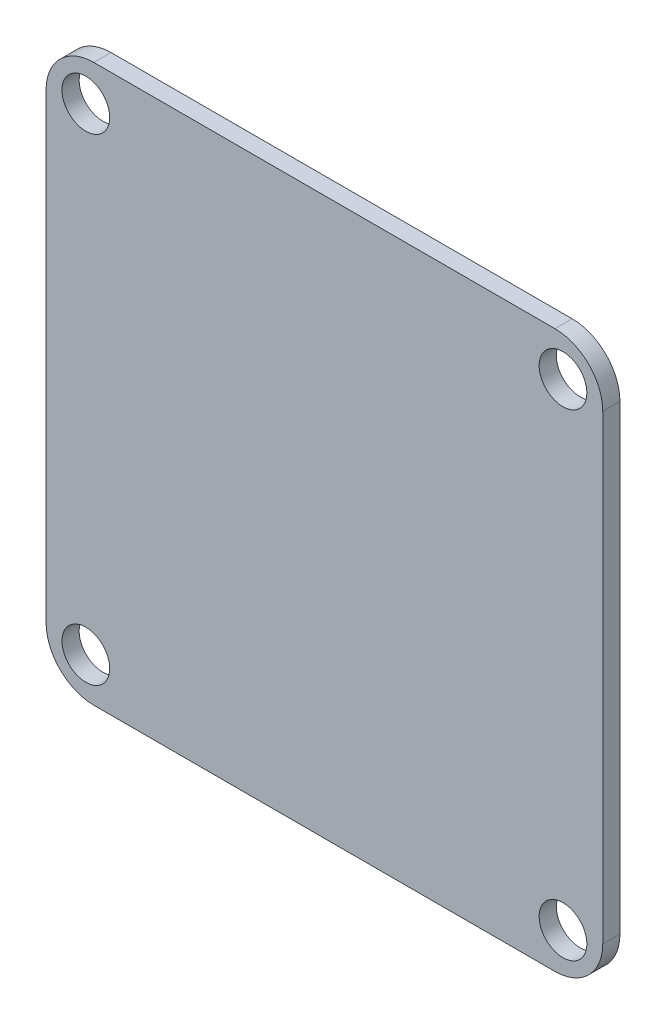
ISO-10303-21;
HEADER;
FILE_DESCRIPTION(('STEP AP214'),'2;1');
FILE_NAME('part.step','',(''),(''),'','','');
FILE_SCHEMA(('AUTOMOTIVE_DESIGN { 1 0 10303 214 1 1 1 1 }'));
ENDSEC;
DATA;
#1=APPLICATION_CONTEXT('core data for automotive mechanical design processes');
#2=APPLICATION_PROTOCOL_DEFINITION('international standard','automotive_design',2000,#1);
#3=PRODUCT_CONTEXT('',#1,'mechanical');
#4=PRODUCT('Part','Part','',(#3));
#5=PRODUCT_RELATED_PRODUCT_CATEGORY('part','',(#4));
#6=PRODUCT_DEFINITION_FORMATION('','',#4);
#7=PRODUCT_DEFINITION_CONTEXT('part definition',#1,'design');
#8=PRODUCT_DEFINITION('design','',#6,#7);
#9=PRODUCT_DEFINITION_SHAPE('','',#8);
#10=(LENGTH_UNIT() NAMED_UNIT(*) SI_UNIT(.MILLI.,.METRE.));
#11=(NAMED_UNIT(*) PLANE_ANGLE_UNIT() SI_UNIT($,.RADIAN.));
#12=(NAMED_UNIT(*) SI_UNIT($,.STERADIAN.) SOLID_ANGLE_UNIT());
#13=UNCERTAINTY_MEASURE_WITH_UNIT(LENGTH_MEASURE(1.E-05),#10,'distance_accuracy_value','');
#14=(GEOMETRIC_REPRESENTATION_CONTEXT(3) GLOBAL_UNCERTAINTY_ASSIGNED_CONTEXT((#13)) GLOBAL_UNIT_ASSIGNED_CONTEXT((#10,
#11,#12)) REPRESENTATION_CONTEXT('',''));
#15=CARTESIAN_POINT('',(0.,0.,0.));
#16=DIRECTION('',(0.,0.,1.));
#17=DIRECTION('',(1.,0.,0.));
#18=AXIS2_PLACEMENT_3D('',#15,#16,#17);
#19=CARTESIAN_POINT('',(14.5,-14.5,1.08));
#20=DIRECTION('',(0.,0.,1.));
#21=DIRECTION('',(1.,0.,0.));
#22=AXIS2_PLACEMENT_3D('',#19,#20,#21);
#23=PLANE('',#22);
#24=CARTESIAN_POINT('',(15.,15.,1.08));
#25=DIRECTION('',(0.,0.,1.));
#26=DIRECTION('',(1.,0.,0.));
#27=AXIS2_PLACEMENT_3D('',#24,#25,#26);
#28=CIRCLE('',#27,1.5);
#29=CARTESIAN_POINT('',(16.5,15.,1.08));
#30=VERTEX_POINT('',#29);
#31=EDGE_CURVE('E248',#30,#30,#28,.T.);
#32=ORIENTED_EDGE('',*,*,#31,.F.);
#33=EDGE_LOOP('',(#32));
#34=FACE_BOUND('',#33,.T.);
#35=CARTESIAN_POINT('',(-15.,-15.,1.08));
#36=DIRECTION('',(0.,0.,1.));
#37=DIRECTION('',(1.,0.,0.));
#38=AXIS2_PLACEMENT_3D('',#35,#36,#37);
#39=CIRCLE('',#38,1.5);
#40=CARTESIAN_POINT('',(-13.5,-15.,1.08));
#41=VERTEX_POINT('',#40);
#42=EDGE_CURVE('E171',#41,#41,#39,.T.);
#43=ORIENTED_EDGE('',*,*,#42,.F.);
#44=EDGE_LOOP('',(#43));
#45=FACE_BOUND('',#44,.T.);
#46=CARTESIAN_POINT('',(14.5,-14.5,1.08));
#47=DIRECTION('',(0.,0.,1.));
#48=DIRECTION('',(1.,0.,0.));
#49=AXIS2_PLACEMENT_3D('',#46,#47,#48);
#50=CIRCLE('',#49,3.);
#51=CARTESIAN_POINT('',(14.5,-17.5,1.08));
#52=VERTEX_POINT('',#51);
#53=CARTESIAN_POINT('',(17.5,-14.5,1.08));
#54=VERTEX_POINT('',#53);
#55=EDGE_CURVE('E192',#52,#54,#50,.T.);
#56=ORIENTED_EDGE('',*,*,#55,.T.);
#57=DIRECTION('',(0.,1.,0.));
#58=VECTOR('',#57,1.);
#59=CARTESIAN_POINT('',(17.5,-14.5,1.08));
#60=LINE('',#59,#58);
#61=CARTESIAN_POINT('',(17.5,14.5,1.08));
#62=VERTEX_POINT('',#61);
#63=EDGE_CURVE('E123',#54,#62,#60,.T.);
#64=ORIENTED_EDGE('',*,*,#63,.T.);
#65=CARTESIAN_POINT('',(14.5,14.5,1.08));
#66=DIRECTION('',(0.,0.,1.));
#67=DIRECTION('',(-1.,0.,0.));
#68=AXIS2_PLACEMENT_3D('',#65,#66,#67);
#69=CIRCLE('',#68,3.);
#70=CARTESIAN_POINT('',(14.5,17.5,1.08));
#71=VERTEX_POINT('',#70);
#72=EDGE_CURVE('E211',#62,#71,#69,.T.);
#73=ORIENTED_EDGE('',*,*,#72,.T.);
#74=DIRECTION('',(-1.,0.,0.));
#75=VECTOR('',#74,1.);
#76=CARTESIAN_POINT('',(-14.5,17.5,1.08));
#77=LINE('',#76,#75);
#78=CARTESIAN_POINT('',(-14.5,17.5,1.08));
#79=VERTEX_POINT('',#78);
#80=EDGE_CURVE('E230',#71,#79,#77,.T.);
#81=ORIENTED_EDGE('',*,*,#80,.T.);
#82=CARTESIAN_POINT('',(-14.5,14.5,1.08));
#83=DIRECTION('',(0.,0.,1.));
#84=DIRECTION('',(-1.,0.,0.));
#85=AXIS2_PLACEMENT_3D('',#82,#83,#84);
#86=CIRCLE('',#85,3.);
#87=CARTESIAN_POINT('',(-17.5,14.5,1.08));
#88=VERTEX_POINT('',#87);
#89=EDGE_CURVE('E144',#79,#88,#86,.T.);
#90=ORIENTED_EDGE('',*,*,#89,.T.);
#91=DIRECTION('',(0.,-1.,0.));
#92=VECTOR('',#91,1.);
#93=CARTESIAN_POINT('',(-17.5,-14.5,1.08));
#94=LINE('',#93,#92);
#95=CARTESIAN_POINT('',(-17.5,-14.5,1.08));
#96=VERTEX_POINT('',#95);
#97=EDGE_CURVE('E137',#88,#96,#94,.T.);
#98=ORIENTED_EDGE('',*,*,#97,.T.);
#99=CARTESIAN_POINT('',(-14.5,-14.5,1.08));
#100=DIRECTION('',(0.,0.,1.));
#101=DIRECTION('',(-1.,0.,0.));
#102=AXIS2_PLACEMENT_3D('',#99,#100,#101);
#103=CIRCLE('',#102,3.);
#104=CARTESIAN_POINT('',(-14.5,-17.5,1.08));
#105=VERTEX_POINT('',#104);
#106=EDGE_CURVE('E142',#96,#105,#103,.T.);
#107=ORIENTED_EDGE('',*,*,#106,.T.);
#108=DIRECTION('',(1.,0.,0.));
#109=VECTOR('',#108,1.);
#110=CARTESIAN_POINT('',(-14.5,-17.5,1.08));
#111=LINE('',#110,#109);
#112=EDGE_CURVE('E64',#105,#52,#111,.T.);
#113=ORIENTED_EDGE('',*,*,#112,.T.);
#114=EDGE_LOOP('',(#56,#64,#73,#81,#90,#98,#107,#113));
#115=FACE_BOUND('',#114,.T.);
#116=CARTESIAN_POINT('',(15.,-15.,1.08));
#117=DIRECTION('',(0.,0.,1.));
#118=DIRECTION('',(-1.,0.,0.));
#119=AXIS2_PLACEMENT_3D('',#116,#117,#118);
#120=CIRCLE('',#119,1.5);
#121=CARTESIAN_POINT('',(13.5,-15.,1.08));
#122=VERTEX_POINT('',#121);
#123=EDGE_CURVE('E245',#122,#122,#120,.T.);
#124=ORIENTED_EDGE('',*,*,#123,.F.);
#125=EDGE_LOOP('',(#124));
#126=FACE_BOUND('',#125,.T.);
#127=CARTESIAN_POINT('',(-15.,15.,1.08));
#128=DIRECTION('',(0.,0.,1.));
#129=DIRECTION('',(-1.,0.,0.));
#130=AXIS2_PLACEMENT_3D('',#127,#128,#129);
#131=CIRCLE('',#130,1.5);
#132=CARTESIAN_POINT('',(-16.5,15.,1.08));
#133=VERTEX_POINT('',#132);
#134=EDGE_CURVE('E256',#133,#133,#131,.T.);
#135=ORIENTED_EDGE('',*,*,#134,.F.);
#136=EDGE_LOOP('',(#135));
#137=FACE_BOUND('',#136,.T.);
#138=ADVANCED_FACE('F43',(#34,#45,#115,#126,#137),#23,.T.);
#139=CARTESIAN_POINT('',(14.5,-14.5,0.));
#140=DIRECTION('',(0.,0.,1.));
#141=DIRECTION('',(1.,0.,0.));
#142=AXIS2_PLACEMENT_3D('',#139,#140,#141);
#143=PLANE('',#142);
#144=CARTESIAN_POINT('',(14.5,-14.5,0.));
#145=DIRECTION('',(0.,0.,1.));
#146=DIRECTION('',(1.,0.,0.));
#147=AXIS2_PLACEMENT_3D('',#144,#145,#146);
#148=CIRCLE('',#147,3.);
#149=CARTESIAN_POINT('',(14.5,-17.5,0.));
#150=VERTEX_POINT('',#149);
#151=CARTESIAN_POINT('',(17.5,-14.5,0.));
#152=VERTEX_POINT('',#151);
#153=EDGE_CURVE('E166',#150,#152,#148,.T.);
#154=ORIENTED_EDGE('',*,*,#153,.F.);
#155=DIRECTION('',(1.,0.,0.));
#156=VECTOR('',#155,1.);
#157=CARTESIAN_POINT('',(-14.5,-17.5,0.));
#158=LINE('',#157,#156);
#159=CARTESIAN_POINT('',(-14.5,-17.5,0.));
#160=VERTEX_POINT('',#159);
#161=EDGE_CURVE('E112',#160,#150,#158,.T.);
#162=ORIENTED_EDGE('',*,*,#161,.F.);
#163=CARTESIAN_POINT('',(-14.5,-14.5,0.));
#164=DIRECTION('',(0.,0.,1.));
#165=DIRECTION('',(-1.,0.,0.));
#166=AXIS2_PLACEMENT_3D('',#163,#164,#165);
#167=CIRCLE('',#166,3.);
#168=CARTESIAN_POINT('',(-17.5,-14.5,0.));
#169=VERTEX_POINT('',#168);
#170=EDGE_CURVE('E104',#169,#160,#167,.T.);
#171=ORIENTED_EDGE('',*,*,#170,.F.);
#172=DIRECTION('',(0.,-1.,0.));
#173=VECTOR('',#172,1.);
#174=CARTESIAN_POINT('',(-17.5,-14.5,0.));
#175=LINE('',#174,#173);
#176=CARTESIAN_POINT('',(-17.5,14.5,0.));
#177=VERTEX_POINT('',#176);
#178=EDGE_CURVE('E152',#177,#169,#175,.T.);
#179=ORIENTED_EDGE('',*,*,#178,.F.);
#180=CARTESIAN_POINT('',(-14.5,14.5,0.));
#181=DIRECTION('',(0.,0.,1.));
#182=DIRECTION('',(-1.,0.,0.));
#183=AXIS2_PLACEMENT_3D('',#180,#181,#182);
#184=CIRCLE('',#183,3.);
#185=CARTESIAN_POINT('',(-14.5,17.5,0.));
#186=VERTEX_POINT('',#185);
#187=EDGE_CURVE('E185',#186,#177,#184,.T.);
#188=ORIENTED_EDGE('',*,*,#187,.F.);
#189=DIRECTION('',(-1.,0.,0.));
#190=VECTOR('',#189,1.);
#191=CARTESIAN_POINT('',(-14.5,17.5,0.));
#192=LINE('',#191,#190);
#193=CARTESIAN_POINT('',(14.5,17.5,0.));
#194=VERTEX_POINT('',#193);
#195=EDGE_CURVE('E177',#194,#186,#192,.T.);
#196=ORIENTED_EDGE('',*,*,#195,.F.);
#197=CARTESIAN_POINT('',(14.5,14.5,0.));
#198=DIRECTION('',(0.,0.,1.));
#199=DIRECTION('',(-1.,0.,0.));
#200=AXIS2_PLACEMENT_3D('',#197,#198,#199);
#201=CIRCLE('',#200,3.);
#202=CARTESIAN_POINT('',(17.5,14.5,0.));
#203=VERTEX_POINT('',#202);
#204=EDGE_CURVE('E176',#203,#194,#201,.T.);
#205=ORIENTED_EDGE('',*,*,#204,.F.);
#206=DIRECTION('',(0.,1.,0.));
#207=VECTOR('',#206,1.);
#208=CARTESIAN_POINT('',(17.5,-14.5,0.));
#209=LINE('',#208,#207);
#210=EDGE_CURVE('E175',#152,#203,#209,.T.);
#211=ORIENTED_EDGE('',*,*,#210,.F.);
#212=EDGE_LOOP('',(#154,#162,#171,#179,#188,#196,#205,#211));
#213=FACE_BOUND('',#212,.T.);
#214=CARTESIAN_POINT('',(-15.,-15.,0.));
#215=DIRECTION('',(0.,0.,1.));
#216=DIRECTION('',(1.,0.,0.));
#217=AXIS2_PLACEMENT_3D('',#214,#215,#216);
#218=CIRCLE('',#217,1.5);
#219=CARTESIAN_POINT('',(-13.5,-15.,0.));
#220=VERTEX_POINT('',#219);
#221=EDGE_CURVE('E239',#220,#220,#218,.T.);
#222=ORIENTED_EDGE('',*,*,#221,.T.);
#223=EDGE_LOOP('',(#222));
#224=FACE_BOUND('',#223,.T.);
#225=CARTESIAN_POINT('',(15.,-15.,0.));
#226=DIRECTION('',(0.,0.,1.));
#227=DIRECTION('',(-1.,0.,0.));
#228=AXIS2_PLACEMENT_3D('',#225,#226,#227);
#229=CIRCLE('',#228,1.5);
#230=CARTESIAN_POINT('',(13.5,-15.,0.));
#231=VERTEX_POINT('',#230);
#232=EDGE_CURVE('E247',#231,#231,#229,.T.);
#233=ORIENTED_EDGE('',*,*,#232,.T.);
#234=EDGE_LOOP('',(#233));
#235=FACE_BOUND('',#234,.T.);
#236=CARTESIAN_POINT('',(15.,15.,0.));
#237=DIRECTION('',(0.,0.,1.));
#238=DIRECTION('',(1.,0.,0.));
#239=AXIS2_PLACEMENT_3D('',#236,#237,#238);
#240=CIRCLE('',#239,1.5);
#241=CARTESIAN_POINT('',(16.5,15.,0.));
#242=VERTEX_POINT('',#241);
#243=EDGE_CURVE('E252',#242,#242,#240,.T.);
#244=ORIENTED_EDGE('',*,*,#243,.T.);
#245=EDGE_LOOP('',(#244));
#246=FACE_BOUND('',#245,.T.);
#247=CARTESIAN_POINT('',(-15.,15.,0.));
#248=DIRECTION('',(0.,0.,1.));
#249=DIRECTION('',(-1.,0.,0.));
#250=AXIS2_PLACEMENT_3D('',#247,#248,#249);
#251=CIRCLE('',#250,1.5);
#252=CARTESIAN_POINT('',(-16.5,15.,0.));
#253=VERTEX_POINT('',#252);
#254=EDGE_CURVE('E265',#253,#253,#251,.T.);
#255=ORIENTED_EDGE('',*,*,#254,.T.);
#256=EDGE_LOOP('',(#255));
#257=FACE_BOUND('',#256,.T.);
#258=ADVANCED_FACE('F220',(#213,#224,#235,#246,#257),#143,.F.);
#259=CARTESIAN_POINT('',(14.5,-14.5,1.08));
#260=DIRECTION('',(0.,0.,-1.));
#261=DIRECTION('',(-1.,0.,0.));
#262=AXIS2_PLACEMENT_3D('',#259,#260,#261);
#263=CYLINDRICAL_SURFACE('',#262,3.);
#264=ORIENTED_EDGE('',*,*,#153,.T.);
#265=DIRECTION('',(0.,0.,-1.));
#266=VECTOR('',#265,1.);
#267=CARTESIAN_POINT('',(17.5,-14.5,1.08));
#268=LINE('',#267,#266);
#269=EDGE_CURVE('E11',#54,#152,#268,.T.);
#270=ORIENTED_EDGE('',*,*,#269,.F.);
#271=ORIENTED_EDGE('',*,*,#55,.F.);
#272=DIRECTION('',(0.,0.,-1.));
#273=VECTOR('',#272,1.);
#274=CARTESIAN_POINT('',(14.5,-17.5,1.08));
#275=LINE('',#274,#273);
#276=EDGE_CURVE('E162',#52,#150,#275,.T.);
#277=ORIENTED_EDGE('',*,*,#276,.T.);
#278=EDGE_LOOP('',(#264,#270,#271,#277));
#279=FACE_BOUND('',#278,.T.);
#280=ADVANCED_FACE('F44',(#279),#263,.T.);
#281=CARTESIAN_POINT('',(17.5,-14.5,1.08));
#282=DIRECTION('',(-1.,0.,0.));
#283=DIRECTION('',(0.,0.,1.));
#284=AXIS2_PLACEMENT_3D('',#281,#282,#283);
#285=PLANE('',#284);
#286=ORIENTED_EDGE('',*,*,#210,.T.);
#287=DIRECTION('',(0.,0.,-1.));
#288=VECTOR('',#287,1.);
#289=CARTESIAN_POINT('',(17.5,14.5,1.08));
#290=LINE('',#289,#288);
#291=EDGE_CURVE('E52',#62,#203,#290,.T.);
#292=ORIENTED_EDGE('',*,*,#291,.F.);
#293=ORIENTED_EDGE('',*,*,#63,.F.);
#294=ORIENTED_EDGE('',*,*,#269,.T.);
#295=EDGE_LOOP('',(#286,#292,#293,#294));
#296=FACE_BOUND('',#295,.T.);
#297=ADVANCED_FACE('F297',(#296),#285,.F.);
#298=CARTESIAN_POINT('',(14.5,14.5,1.08));
#299=DIRECTION('',(0.,0.,-1.));
#300=DIRECTION('',(-1.,0.,0.));
#301=AXIS2_PLACEMENT_3D('',#298,#299,#300);
#302=CYLINDRICAL_SURFACE('',#301,3.);
#303=ORIENTED_EDGE('',*,*,#204,.T.);
#304=DIRECTION('',(0.,0.,-1.));
#305=VECTOR('',#304,1.);
#306=CARTESIAN_POINT('',(14.5,17.5,1.08));
#307=LINE('',#306,#305);
#308=EDGE_CURVE('E205',#71,#194,#307,.T.);
#309=ORIENTED_EDGE('',*,*,#308,.F.);
#310=ORIENTED_EDGE('',*,*,#72,.F.);
#311=ORIENTED_EDGE('',*,*,#291,.T.);
#312=EDGE_LOOP('',(#303,#309,#310,#311));
#313=FACE_BOUND('',#312,.T.);
#314=ADVANCED_FACE('F213',(#313),#302,.T.);
#315=CARTESIAN_POINT('',(-14.5,17.5,1.08));
#316=DIRECTION('',(0.,-1.,0.));
#317=DIRECTION('',(0.,0.,-1.));
#318=AXIS2_PLACEMENT_3D('',#315,#316,#317);
#319=PLANE('',#318);
#320=ORIENTED_EDGE('',*,*,#195,.T.);
#321=DIRECTION('',(0.,0.,-1.));
#322=VECTOR('',#321,1.);
#323=CARTESIAN_POINT('',(-14.5,17.5,1.08));
#324=LINE('',#323,#322);
#325=EDGE_CURVE('E196',#79,#186,#324,.T.);
#326=ORIENTED_EDGE('',*,*,#325,.F.);
#327=ORIENTED_EDGE('',*,*,#80,.F.);
#328=ORIENTED_EDGE('',*,*,#308,.T.);
#329=EDGE_LOOP('',(#320,#326,#327,#328));
#330=FACE_BOUND('',#329,.T.);
#331=ADVANCED_FACE('F225',(#330),#319,.F.);
#332=CARTESIAN_POINT('',(-14.5,14.5,1.08));
#333=DIRECTION('',(0.,0.,-1.));
#334=DIRECTION('',(-1.,0.,0.));
#335=AXIS2_PLACEMENT_3D('',#332,#333,#334);
#336=CYLINDRICAL_SURFACE('',#335,3.);
#337=ORIENTED_EDGE('',*,*,#187,.T.);
#338=DIRECTION('',(0.,0.,-1.));
#339=VECTOR('',#338,1.);
#340=CARTESIAN_POINT('',(-17.5,14.5,1.08));
#341=LINE('',#340,#339);
#342=EDGE_CURVE('E157',#88,#177,#341,.T.);
#343=ORIENTED_EDGE('',*,*,#342,.F.);
#344=ORIENTED_EDGE('',*,*,#89,.F.);
#345=ORIENTED_EDGE('',*,*,#325,.T.);
#346=EDGE_LOOP('',(#337,#343,#344,#345));
#347=FACE_BOUND('',#346,.T.);
#348=ADVANCED_FACE('F224',(#347),#336,.T.);
#349=CARTESIAN_POINT('',(-17.5,-14.5,1.08));
#350=DIRECTION('',(1.,0.,0.));
#351=DIRECTION('',(0.,0.,-1.));
#352=AXIS2_PLACEMENT_3D('',#349,#350,#351);
#353=PLANE('',#352);
#354=ORIENTED_EDGE('',*,*,#178,.T.);
#355=DIRECTION('',(0.,0.,-1.));
#356=VECTOR('',#355,1.);
#357=CARTESIAN_POINT('',(-17.5,-14.5,1.08));
#358=LINE('',#357,#356);
#359=EDGE_CURVE('E153',#96,#169,#358,.T.);
#360=ORIENTED_EDGE('',*,*,#359,.F.);
#361=ORIENTED_EDGE('',*,*,#97,.F.);
#362=ORIENTED_EDGE('',*,*,#342,.T.);
#363=EDGE_LOOP('',(#354,#360,#361,#362));
#364=FACE_BOUND('',#363,.T.);
#365=ADVANCED_FACE('F155',(#364),#353,.F.);
#366=CARTESIAN_POINT('',(-14.5,-14.5,1.08));
#367=DIRECTION('',(0.,0.,-1.));
#368=DIRECTION('',(-1.,0.,0.));
#369=AXIS2_PLACEMENT_3D('',#366,#367,#368);
#370=CYLINDRICAL_SURFACE('',#369,3.);
#371=ORIENTED_EDGE('',*,*,#170,.T.);
#372=DIRECTION('',(0.,0.,-1.));
#373=VECTOR('',#372,1.);
#374=CARTESIAN_POINT('',(-14.5,-17.5,1.08));
#375=LINE('',#374,#373);
#376=EDGE_CURVE('E160',#105,#160,#375,.T.);
#377=ORIENTED_EDGE('',*,*,#376,.F.);
#378=ORIENTED_EDGE('',*,*,#106,.F.);
#379=ORIENTED_EDGE('',*,*,#359,.T.);
#380=EDGE_LOOP('',(#371,#377,#378,#379));
#381=FACE_BOUND('',#380,.T.);
#382=ADVANCED_FACE('F159',(#381),#370,.T.);
#383=CARTESIAN_POINT('',(-14.5,-17.5,1.08));
#384=DIRECTION('',(0.,1.,0.));
#385=DIRECTION('',(0.,0.,1.));
#386=AXIS2_PLACEMENT_3D('',#383,#384,#385);
#387=PLANE('',#386);
#388=ORIENTED_EDGE('',*,*,#161,.T.);
#389=ORIENTED_EDGE('',*,*,#276,.F.);
#390=ORIENTED_EDGE('',*,*,#112,.F.);
#391=ORIENTED_EDGE('',*,*,#376,.T.);
#392=EDGE_LOOP('',(#388,#389,#390,#391));
#393=FACE_BOUND('',#392,.T.);
#394=ADVANCED_FACE('F290',(#393),#387,.F.);
#395=CARTESIAN_POINT('',(-15.,-15.,1.08));
#396=DIRECTION('',(0.,0.,-1.));
#397=DIRECTION('',(-1.,0.,0.));
#398=AXIS2_PLACEMENT_3D('',#395,#396,#397);
#399=CYLINDRICAL_SURFACE('',#398,1.5);
#400=ORIENTED_EDGE('',*,*,#42,.T.);
#401=EDGE_LOOP('',(#400));
#402=FACE_BOUND('',#401,.T.);
#403=ORIENTED_EDGE('',*,*,#221,.F.);
#404=EDGE_LOOP('',(#403));
#405=FACE_BOUND('',#404,.T.);
#406=ADVANCED_FACE('F281',(#402,#405),#399,.F.);
#407=CARTESIAN_POINT('',(15.,-15.,1.08));
#408=DIRECTION('',(0.,0.,-1.));
#409=DIRECTION('',(-1.,0.,0.));
#410=AXIS2_PLACEMENT_3D('',#407,#408,#409);
#411=CYLINDRICAL_SURFACE('',#410,1.5);
#412=ORIENTED_EDGE('',*,*,#123,.T.);
#413=EDGE_LOOP('',(#412));
#414=FACE_BOUND('',#413,.T.);
#415=ORIENTED_EDGE('',*,*,#232,.F.);
#416=EDGE_LOOP('',(#415));
#417=FACE_BOUND('',#416,.T.);
#418=ADVANCED_FACE('F373',(#414,#417),#411,.F.);
#419=CARTESIAN_POINT('',(15.,15.,1.08));
#420=DIRECTION('',(0.,0.,-1.));
#421=DIRECTION('',(-1.,0.,0.));
#422=AXIS2_PLACEMENT_3D('',#419,#420,#421);
#423=CYLINDRICAL_SURFACE('',#422,1.5);
#424=ORIENTED_EDGE('',*,*,#31,.T.);
#425=EDGE_LOOP('',(#424));
#426=FACE_BOUND('',#425,.T.);
#427=ORIENTED_EDGE('',*,*,#243,.F.);
#428=EDGE_LOOP('',(#427));
#429=FACE_BOUND('',#428,.T.);
#430=ADVANCED_FACE('F384',(#426,#429),#423,.F.);
#431=CARTESIAN_POINT('',(-15.,15.,1.08));
#432=DIRECTION('',(0.,0.,-1.));
#433=DIRECTION('',(-1.,0.,0.));
#434=AXIS2_PLACEMENT_3D('',#431,#432,#433);
#435=CYLINDRICAL_SURFACE('',#434,1.5);
#436=ORIENTED_EDGE('',*,*,#134,.T.);
#437=EDGE_LOOP('',(#436));
#438=FACE_BOUND('',#437,.T.);
#439=ORIENTED_EDGE('',*,*,#254,.F.);
#440=EDGE_LOOP('',(#439));
#441=FACE_BOUND('',#440,.T.);
#442=ADVANCED_FACE('F269',(#438,#441),#435,.F.);
#443=CLOSED_SHELL('',(#138,#258,#280,#297,#314,#331,#348,#365,#382,#394,#406,#418,#430,#442));
#444=MANIFOLD_SOLID_BREP('B2',#443);
#445=ADVANCED_BREP_SHAPE_REPRESENTATION('',(#18,#444),#14);
#446=SHAPE_DEFINITION_REPRESENTATION(#9,#445);
ENDSEC;
END-ISO-10303-21;
